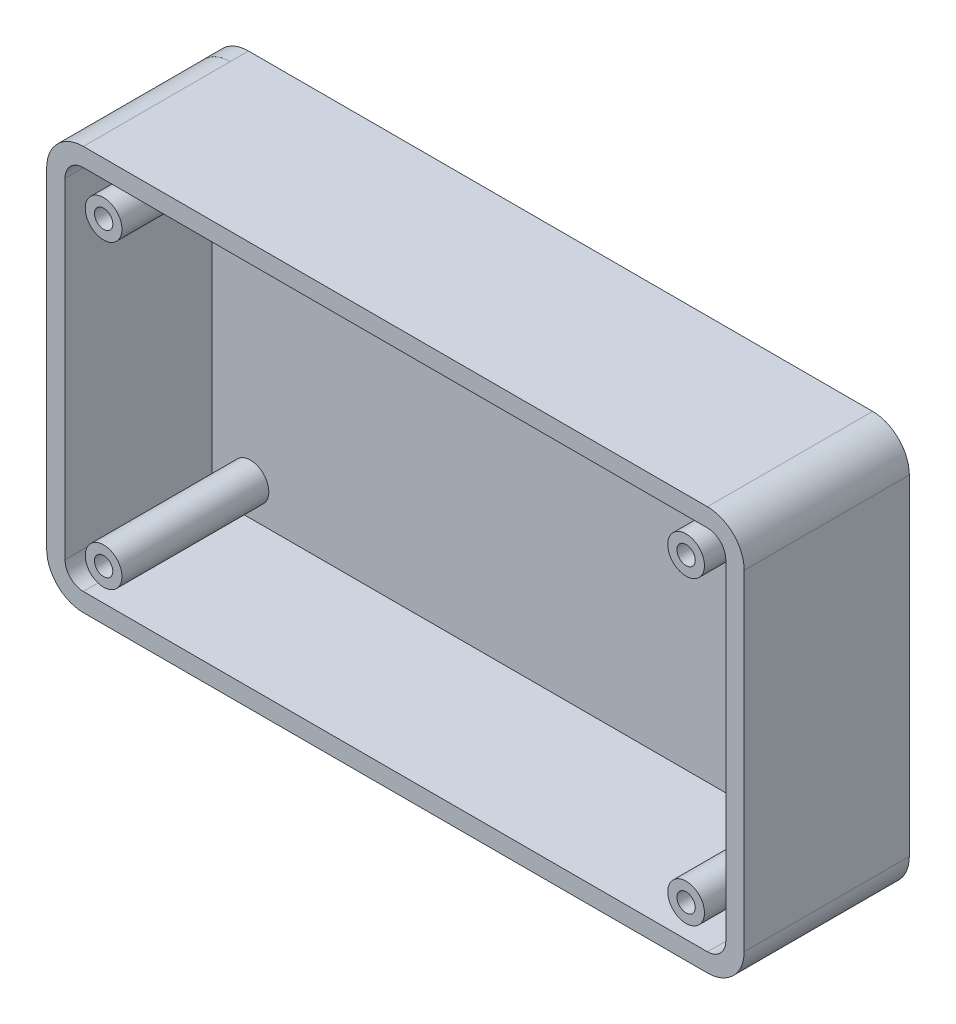
ISO-10303-21;
HEADER;
FILE_DESCRIPTION(('STEP AP214'),'2;1');
FILE_NAME('part.step','',(''),(''),'','','');
FILE_SCHEMA(('AUTOMOTIVE_DESIGN { 1 0 10303 214 1 1 1 1 }'));
ENDSEC;
DATA;
#1=APPLICATION_CONTEXT('core data for automotive mechanical design processes');
#2=APPLICATION_PROTOCOL_DEFINITION('international standard','automotive_design',2000,#1);
#3=PRODUCT_CONTEXT('',#1,'mechanical');
#4=PRODUCT('Part','Part','',(#3));
#5=PRODUCT_RELATED_PRODUCT_CATEGORY('part','',(#4));
#6=PRODUCT_DEFINITION_FORMATION('','',#4);
#7=PRODUCT_DEFINITION_CONTEXT('part definition',#1,'design');
#8=PRODUCT_DEFINITION('design','',#6,#7);
#9=PRODUCT_DEFINITION_SHAPE('','',#8);
#10=(LENGTH_UNIT() NAMED_UNIT(*) SI_UNIT(.MILLI.,.METRE.));
#11=(NAMED_UNIT(*) PLANE_ANGLE_UNIT() SI_UNIT($,.RADIAN.));
#12=(NAMED_UNIT(*) SI_UNIT($,.STERADIAN.) SOLID_ANGLE_UNIT());
#13=UNCERTAINTY_MEASURE_WITH_UNIT(LENGTH_MEASURE(1.E-05),#10,'distance_accuracy_value','');
#14=(GEOMETRIC_REPRESENTATION_CONTEXT(3) GLOBAL_UNCERTAINTY_ASSIGNED_CONTEXT((#13)) GLOBAL_UNIT_ASSIGNED_CONTEXT((#10,
#11,#12)) REPRESENTATION_CONTEXT('',''));
#15=CARTESIAN_POINT('',(0.,0.,0.));
#16=DIRECTION('',(0.,0.,1.));
#17=DIRECTION('',(1.,0.,0.));
#18=AXIS2_PLACEMENT_3D('',#15,#16,#17);
#19=CARTESIAN_POINT('',(-85.,-45.,40.));
#20=DIRECTION('',(0.,0.,1.));
#21=DIRECTION('',(1.,0.,0.));
#22=AXIS2_PLACEMENT_3D('',#19,#20,#21);
#23=PLANE('',#22);
#24=CARTESIAN_POINT('',(-85.,-45.,40.));
#25=DIRECTION('',(0.,0.,1.));
#26=DIRECTION('',(1.,0.,0.));
#27=AXIS2_PLACEMENT_3D('',#24,#25,#26);
#28=CIRCLE('',#27,10.);
#29=CARTESIAN_POINT('',(-95.,-45.,40.));
#30=VERTEX_POINT('',#29);
#31=CARTESIAN_POINT('',(-85.,-55.,40.));
#32=VERTEX_POINT('',#31);
#33=EDGE_CURVE('E163',#30,#32,#28,.T.);
#34=ORIENTED_EDGE('',*,*,#33,.T.);
#35=DIRECTION('',(1.,0.,0.));
#36=VECTOR('',#35,1.);
#37=CARTESIAN_POINT('',(-85.,-55.,40.));
#38=LINE('',#37,#36);
#39=CARTESIAN_POINT('',(84.9999999999999,-55.,40.));
#40=VERTEX_POINT('',#39);
#41=EDGE_CURVE('E241',#32,#40,#38,.T.);
#42=ORIENTED_EDGE('',*,*,#41,.T.);
#43=CARTESIAN_POINT('',(85.,-45.,40.));
#44=DIRECTION('',(0.,0.,1.));
#45=DIRECTION('',(-1.,0.,0.));
#46=AXIS2_PLACEMENT_3D('',#43,#44,#45);
#47=CIRCLE('',#46,10.);
#48=CARTESIAN_POINT('',(95.,-45.,40.));
#49=VERTEX_POINT('',#48);
#50=EDGE_CURVE('E243',#40,#49,#47,.T.);
#51=ORIENTED_EDGE('',*,*,#50,.T.);
#52=DIRECTION('',(0.,1.,0.));
#53=VECTOR('',#52,1.);
#54=CARTESIAN_POINT('',(95.,-45.,40.));
#55=LINE('',#54,#53);
#56=CARTESIAN_POINT('',(95.,44.9999999999999,40.));
#57=VERTEX_POINT('',#56);
#58=EDGE_CURVE('E245',#49,#57,#55,.T.);
#59=ORIENTED_EDGE('',*,*,#58,.T.);
#60=CARTESIAN_POINT('',(85.,45.,40.));
#61=DIRECTION('',(0.,0.,1.));
#62=DIRECTION('',(1.,0.,0.));
#63=AXIS2_PLACEMENT_3D('',#60,#61,#62);
#64=CIRCLE('',#63,9.99999999999999);
#65=CARTESIAN_POINT('',(85.,55.,40.));
#66=VERTEX_POINT('',#65);
#67=EDGE_CURVE('E132',#57,#66,#64,.T.);
#68=ORIENTED_EDGE('',*,*,#67,.T.);
#69=DIRECTION('',(-1.,0.,0.));
#70=VECTOR('',#69,1.);
#71=CARTESIAN_POINT('',(-85.,55.,40.));
#72=LINE('',#71,#70);
#73=CARTESIAN_POINT('',(-85.,55.,40.));
#74=VERTEX_POINT('',#73);
#75=EDGE_CURVE('E125',#66,#74,#72,.T.);
#76=ORIENTED_EDGE('',*,*,#75,.T.);
#77=CARTESIAN_POINT('',(-85.,45.,40.));
#78=DIRECTION('',(0.,0.,1.));
#79=DIRECTION('',(1.,0.,0.));
#80=AXIS2_PLACEMENT_3D('',#77,#78,#79);
#81=CIRCLE('',#80,10.);
#82=CARTESIAN_POINT('',(-95.,45.,40.));
#83=VERTEX_POINT('',#82);
#84=EDGE_CURVE('E129',#74,#83,#81,.T.);
#85=ORIENTED_EDGE('',*,*,#84,.T.);
#86=DIRECTION('',(0.,-1.,0.));
#87=VECTOR('',#86,1.);
#88=CARTESIAN_POINT('',(-95.,-45.,40.));
#89=LINE('',#88,#87);
#90=EDGE_CURVE('E62',#83,#30,#89,.T.);
#91=ORIENTED_EDGE('',*,*,#90,.T.);
#92=EDGE_LOOP('',(#34,#42,#51,#59,#68,#76,#85,#91));
#93=FACE_BOUND('',#92,.T.);
#94=DIRECTION('',(-1.,0.,0.));
#95=VECTOR('',#94,1.);
#96=CARTESIAN_POINT('',(-85.,50.,40.));
#97=LINE('',#96,#95);
#98=CARTESIAN_POINT('',(85.,50.,40.));
#99=VERTEX_POINT('',#98);
#100=CARTESIAN_POINT('',(-85.,50.,40.));
#101=VERTEX_POINT('',#100);
#102=EDGE_CURVE('E219',#99,#101,#97,.T.);
#103=ORIENTED_EDGE('',*,*,#102,.F.);
#104=CARTESIAN_POINT('',(85.,45.,40.));
#105=DIRECTION('',(0.,0.,1.));
#106=DIRECTION('',(1.,0.,0.));
#107=AXIS2_PLACEMENT_3D('',#104,#105,#106);
#108=CIRCLE('',#107,5.);
#109=CARTESIAN_POINT('',(90.,45.,40.));
#110=VERTEX_POINT('',#109);
#111=EDGE_CURVE('E216',#110,#99,#108,.T.);
#112=ORIENTED_EDGE('',*,*,#111,.F.);
#113=DIRECTION('',(0.,1.,0.));
#114=VECTOR('',#113,1.);
#115=CARTESIAN_POINT('',(90.,-45.,40.));
#116=LINE('',#115,#114);
#117=CARTESIAN_POINT('',(90.,-45.,40.));
#118=VERTEX_POINT('',#117);
#119=EDGE_CURVE('E84',#118,#110,#116,.T.);
#120=ORIENTED_EDGE('',*,*,#119,.F.);
#121=CARTESIAN_POINT('',(85.,-45.,40.));
#122=DIRECTION('',(0.,0.,1.));
#123=DIRECTION('',(-1.,0.,0.));
#124=AXIS2_PLACEMENT_3D('',#121,#122,#123);
#125=CIRCLE('',#124,5.);
#126=CARTESIAN_POINT('',(85.,-50.,40.));
#127=VERTEX_POINT('',#126);
#128=EDGE_CURVE('E329',#127,#118,#125,.T.);
#129=ORIENTED_EDGE('',*,*,#128,.F.);
#130=DIRECTION('',(1.,0.,0.));
#131=VECTOR('',#130,1.);
#132=CARTESIAN_POINT('',(-85.,-50.,40.));
#133=LINE('',#132,#131);
#134=CARTESIAN_POINT('',(-85.,-50.,40.));
#135=VERTEX_POINT('',#134);
#136=EDGE_CURVE('E327',#135,#127,#133,.T.);
#137=ORIENTED_EDGE('',*,*,#136,.F.);
#138=CARTESIAN_POINT('',(-85.,-45.,40.));
#139=DIRECTION('',(0.,0.,1.));
#140=DIRECTION('',(1.,0.,0.));
#141=AXIS2_PLACEMENT_3D('',#138,#139,#140);
#142=CIRCLE('',#141,5.);
#143=CARTESIAN_POINT('',(-90.,-45.,40.));
#144=VERTEX_POINT('',#143);
#145=EDGE_CURVE('E324',#144,#135,#142,.T.);
#146=ORIENTED_EDGE('',*,*,#145,.F.);
#147=DIRECTION('',(0.,-1.,0.));
#148=VECTOR('',#147,1.);
#149=CARTESIAN_POINT('',(-90.,-45.,40.));
#150=LINE('',#149,#148);
#151=CARTESIAN_POINT('',(-90.,45.,40.));
#152=VERTEX_POINT('',#151);
#153=EDGE_CURVE('E321',#152,#144,#150,.T.);
#154=ORIENTED_EDGE('',*,*,#153,.F.);
#155=CARTESIAN_POINT('',(-85.,45.,40.));
#156=DIRECTION('',(0.,0.,1.));
#157=DIRECTION('',(1.,0.,0.));
#158=AXIS2_PLACEMENT_3D('',#155,#156,#157);
#159=CIRCLE('',#158,5.);
#160=EDGE_CURVE('E318',#101,#152,#159,.T.);
#161=ORIENTED_EDGE('',*,*,#160,.F.);
#162=EDGE_LOOP('',(#103,#112,#120,#129,#137,#146,#154,#161));
#163=FACE_BOUND('',#162,.T.);
#164=ADVANCED_FACE('F37',(#93,#163),#23,.T.);
#165=CARTESIAN_POINT('',(-85.,-45.,40.));
#166=DIRECTION('',(0.,0.,-1.));
#167=DIRECTION('',(-1.,0.,0.));
#168=AXIS2_PLACEMENT_3D('',#165,#166,#167);
#169=CYLINDRICAL_SURFACE('',#168,10.);
#170=CARTESIAN_POINT('',(-85.,-45.,0.));
#171=DIRECTION('',(0.,0.,1.));
#172=DIRECTION('',(1.,0.,0.));
#173=AXIS2_PLACEMENT_3D('',#170,#171,#172);
#174=CIRCLE('',#173,10.);
#175=CARTESIAN_POINT('',(-95.,-45.,0.));
#176=VERTEX_POINT('',#175);
#177=CARTESIAN_POINT('',(-85.,-55.,0.));
#178=VERTEX_POINT('',#177);
#179=EDGE_CURVE('E156',#176,#178,#174,.T.);
#180=ORIENTED_EDGE('',*,*,#179,.T.);
#181=DIRECTION('',(0.,0.,-1.));
#182=VECTOR('',#181,1.);
#183=CARTESIAN_POINT('',(-85.,-55.,40.));
#184=LINE('',#183,#182);
#185=EDGE_CURVE('E177',#32,#178,#184,.T.);
#186=ORIENTED_EDGE('',*,*,#185,.F.);
#187=ORIENTED_EDGE('',*,*,#33,.F.);
#188=DIRECTION('',(0.,0.,-1.));
#189=VECTOR('',#188,1.);
#190=CARTESIAN_POINT('',(-95.,-45.,40.));
#191=LINE('',#190,#189);
#192=EDGE_CURVE('E152',#30,#176,#191,.T.);
#193=ORIENTED_EDGE('',*,*,#192,.T.);
#194=EDGE_LOOP('',(#180,#186,#187,#193));
#195=FACE_BOUND('',#194,.T.);
#196=ADVANCED_FACE('F39',(#195),#169,.T.);
#197=CARTESIAN_POINT('',(-85.,-55.,40.));
#198=DIRECTION('',(0.,1.,0.));
#199=DIRECTION('',(-1.,0.,0.));
#200=AXIS2_PLACEMENT_3D('',#197,#198,#199);
#201=PLANE('',#200);
#202=ORIENTED_EDGE('',*,*,#185,.T.);
#203=DIRECTION('',(-1.,0.,0.));
#204=VECTOR('',#203,1.);
#205=CARTESIAN_POINT('',(84.9999999999999,-55.,0.));
#206=LINE('',#205,#204);
#207=CARTESIAN_POINT('',(-85.0258057865892,-55.,0.));
#208=VERTEX_POINT('',#207);
#209=EDGE_CURVE('E298',#178,#208,#206,.T.);
#210=ORIENTED_EDGE('',*,*,#209,.T.);
#211=DIRECTION('',(0.,0.,1.));
#212=VECTOR('',#211,1.);
#213=CARTESIAN_POINT('',(-85.0258057865892,-55.,-5.));
#214=LINE('',#213,#212);
#215=CARTESIAN_POINT('',(-85.0258057865892,-55.,-5.));
#216=VERTEX_POINT('',#215);
#217=EDGE_CURVE('E311',#216,#208,#214,.T.);
#218=ORIENTED_EDGE('',*,*,#217,.F.);
#219=DIRECTION('',(-1.,0.,0.));
#220=VECTOR('',#219,1.);
#221=CARTESIAN_POINT('',(84.9999999999999,-55.,-5.));
#222=LINE('',#221,#220);
#223=CARTESIAN_POINT('',(84.9999999999999,-55.,-5.));
#224=VERTEX_POINT('',#223);
#225=EDGE_CURVE('E284',#224,#216,#222,.T.);
#226=ORIENTED_EDGE('',*,*,#225,.F.);
#227=DIRECTION('',(0.,0.,-1.));
#228=VECTOR('',#227,1.);
#229=CARTESIAN_POINT('',(84.9999999999999,-55.,40.));
#230=LINE('',#229,#228);
#231=EDGE_CURVE('E174',#40,#224,#230,.T.);
#232=ORIENTED_EDGE('',*,*,#231,.F.);
#233=ORIENTED_EDGE('',*,*,#41,.F.);
#234=EDGE_LOOP('',(#202,#210,#218,#226,#232,#233));
#235=FACE_BOUND('',#234,.T.);
#236=ADVANCED_FACE('F412',(#235),#201,.F.);
#237=CARTESIAN_POINT('',(85.,-45.,40.));
#238=DIRECTION('',(0.,0.,-1.));
#239=DIRECTION('',(-1.,0.,0.));
#240=AXIS2_PLACEMENT_3D('',#237,#238,#239);
#241=CYLINDRICAL_SURFACE('',#240,10.);
#242=ORIENTED_EDGE('',*,*,#231,.T.);
#243=CARTESIAN_POINT('',(85.,-45.,-5.));
#244=DIRECTION('',(0.,0.,-1.));
#245=DIRECTION('',(1.,0.,0.));
#246=AXIS2_PLACEMENT_3D('',#243,#244,#245);
#247=CIRCLE('',#246,9.99999999999999);
#248=CARTESIAN_POINT('',(95.,-45.,-5.));
#249=VERTEX_POINT('',#248);
#250=EDGE_CURVE('E281',#249,#224,#247,.T.);
#251=ORIENTED_EDGE('',*,*,#250,.F.);
#252=DIRECTION('',(0.,0.,-1.));
#253=VECTOR('',#252,1.);
#254=CARTESIAN_POINT('',(95.,-45.,40.));
#255=LINE('',#254,#253);
#256=EDGE_CURVE('E171',#49,#249,#255,.T.);
#257=ORIENTED_EDGE('',*,*,#256,.F.);
#258=ORIENTED_EDGE('',*,*,#50,.F.);
#259=EDGE_LOOP('',(#242,#251,#257,#258));
#260=FACE_BOUND('',#259,.T.);
#261=ADVANCED_FACE('F409',(#260),#241,.T.);
#262=CARTESIAN_POINT('',(95.,-45.,40.));
#263=DIRECTION('',(-1.,0.,0.));
#264=DIRECTION('',(0.,-1.,0.));
#265=AXIS2_PLACEMENT_3D('',#262,#263,#264);
#266=PLANE('',#265);
#267=ORIENTED_EDGE('',*,*,#256,.T.);
#268=DIRECTION('',(0.,-1.,0.));
#269=VECTOR('',#268,1.);
#270=CARTESIAN_POINT('',(95.,-44.9999999999999,-5.));
#271=LINE('',#270,#269);
#272=CARTESIAN_POINT('',(95.,44.9999999999999,-5.));
#273=VERTEX_POINT('',#272);
#274=EDGE_CURVE('E255',#273,#249,#271,.T.);
#275=ORIENTED_EDGE('',*,*,#274,.F.);
#276=DIRECTION('',(0.,0.,-1.));
#277=VECTOR('',#276,1.);
#278=CARTESIAN_POINT('',(95.,44.9999999999999,40.));
#279=LINE('',#278,#277);
#280=EDGE_CURVE('E168',#57,#273,#279,.T.);
#281=ORIENTED_EDGE('',*,*,#280,.F.);
#282=ORIENTED_EDGE('',*,*,#58,.F.);
#283=EDGE_LOOP('',(#267,#275,#281,#282));
#284=FACE_BOUND('',#283,.T.);
#285=ADVANCED_FACE('F252',(#284),#266,.F.);
#286=CARTESIAN_POINT('',(85.,45.,40.));
#287=DIRECTION('',(0.,0.,-1.));
#288=DIRECTION('',(-1.,0.,0.));
#289=AXIS2_PLACEMENT_3D('',#286,#287,#288);
#290=CYLINDRICAL_SURFACE('',#289,9.99999999999999);
#291=ORIENTED_EDGE('',*,*,#280,.T.);
#292=CARTESIAN_POINT('',(85.,45.,-5.));
#293=DIRECTION('',(0.,0.,-1.));
#294=DIRECTION('',(1.,0.,0.));
#295=AXIS2_PLACEMENT_3D('',#292,#293,#294);
#296=CIRCLE('',#295,9.99999999999999);
#297=CARTESIAN_POINT('',(84.9999999999999,55.,-5.));
#298=VERTEX_POINT('',#297);
#299=EDGE_CURVE('E261',#298,#273,#296,.T.);
#300=ORIENTED_EDGE('',*,*,#299,.F.);
#301=DIRECTION('',(0.,0.,-1.));
#302=VECTOR('',#301,1.);
#303=CARTESIAN_POINT('',(85.,55.,40.));
#304=LINE('',#303,#302);
#305=EDGE_CURVE('E146',#66,#298,#304,.T.);
#306=ORIENTED_EDGE('',*,*,#305,.F.);
#307=ORIENTED_EDGE('',*,*,#67,.F.);
#308=EDGE_LOOP('',(#291,#300,#306,#307));
#309=FACE_BOUND('',#308,.T.);
#310=ADVANCED_FACE('F259',(#309),#290,.T.);
#311=CARTESIAN_POINT('',(-85.,55.,40.));
#312=DIRECTION('',(0.,-1.,0.));
#313=DIRECTION('',(1.,0.,0.));
#314=AXIS2_PLACEMENT_3D('',#311,#312,#313);
#315=PLANE('',#314);
#316=ORIENTED_EDGE('',*,*,#305,.T.);
#317=DIRECTION('',(1.,0.,0.));
#318=VECTOR('',#317,1.);
#319=CARTESIAN_POINT('',(84.9999999999999,55.,-5.));
#320=LINE('',#319,#318);
#321=CARTESIAN_POINT('',(-85.0258057865892,55.,-5.));
#322=VERTEX_POINT('',#321);
#323=EDGE_CURVE('E265',#322,#298,#320,.T.);
#324=ORIENTED_EDGE('',*,*,#323,.F.);
#325=DIRECTION('',(0.,0.,1.));
#326=VECTOR('',#325,1.);
#327=CARTESIAN_POINT('',(-85.0258057865892,55.,-5.));
#328=LINE('',#327,#326);
#329=CARTESIAN_POINT('',(-85.0258057865892,55.,0.));
#330=VERTEX_POINT('',#329);
#331=EDGE_CURVE('E314',#322,#330,#328,.T.);
#332=ORIENTED_EDGE('',*,*,#331,.T.);
#333=DIRECTION('',(1.,0.,0.));
#334=VECTOR('',#333,1.);
#335=CARTESIAN_POINT('',(84.9999999999999,55.,0.));
#336=LINE('',#335,#334);
#337=CARTESIAN_POINT('',(-85.,55.,0.));
#338=VERTEX_POINT('',#337);
#339=EDGE_CURVE('E144',#330,#338,#336,.T.);
#340=ORIENTED_EDGE('',*,*,#339,.T.);
#341=DIRECTION('',(0.,0.,-1.));
#342=VECTOR('',#341,1.);
#343=CARTESIAN_POINT('',(-85.,55.,40.));
#344=LINE('',#343,#342);
#345=EDGE_CURVE('E139',#74,#338,#344,.T.);
#346=ORIENTED_EDGE('',*,*,#345,.F.);
#347=ORIENTED_EDGE('',*,*,#75,.F.);
#348=EDGE_LOOP('',(#316,#324,#332,#340,#346,#347));
#349=FACE_BOUND('',#348,.T.);
#350=ADVANCED_FACE('F140',(#349),#315,.F.);
#351=CARTESIAN_POINT('',(-85.,45.,40.));
#352=DIRECTION('',(0.,0.,-1.));
#353=DIRECTION('',(-1.,0.,0.));
#354=AXIS2_PLACEMENT_3D('',#351,#352,#353);
#355=CYLINDRICAL_SURFACE('',#354,10.);
#356=CARTESIAN_POINT('',(-85.,45.,0.));
#357=DIRECTION('',(0.,0.,1.));
#358=DIRECTION('',(1.,0.,0.));
#359=AXIS2_PLACEMENT_3D('',#356,#357,#358);
#360=CIRCLE('',#359,10.);
#361=CARTESIAN_POINT('',(-95.,45.,0.));
#362=VERTEX_POINT('',#361);
#363=EDGE_CURVE('E159',#338,#362,#360,.T.);
#364=ORIENTED_EDGE('',*,*,#363,.T.);
#365=DIRECTION('',(0.,0.,-1.));
#366=VECTOR('',#365,1.);
#367=CARTESIAN_POINT('',(-95.,45.,40.));
#368=LINE('',#367,#366);
#369=EDGE_CURVE('E147',#83,#362,#368,.T.);
#370=ORIENTED_EDGE('',*,*,#369,.F.);
#371=ORIENTED_EDGE('',*,*,#84,.F.);
#372=ORIENTED_EDGE('',*,*,#345,.T.);
#373=EDGE_LOOP('',(#364,#370,#371,#372));
#374=FACE_BOUND('',#373,.T.);
#375=ADVANCED_FACE('F149',(#374),#355,.T.);
#376=CARTESIAN_POINT('',(-95.,-45.,40.));
#377=DIRECTION('',(1.,0.,0.));
#378=DIRECTION('',(0.,0.,-1.));
#379=AXIS2_PLACEMENT_3D('',#376,#377,#378);
#380=PLANE('',#379);
#381=DIRECTION('',(0.,-1.,0.));
#382=VECTOR('',#381,1.);
#383=CARTESIAN_POINT('',(-95.,-45.,0.));
#384=LINE('',#383,#382);
#385=EDGE_CURVE('E75',#362,#176,#384,.T.);
#386=ORIENTED_EDGE('',*,*,#385,.T.);
#387=ORIENTED_EDGE('',*,*,#192,.F.);
#388=ORIENTED_EDGE('',*,*,#90,.F.);
#389=ORIENTED_EDGE('',*,*,#369,.T.);
#390=EDGE_LOOP('',(#386,#387,#388,#389));
#391=FACE_BOUND('',#390,.T.);
#392=ADVANCED_FACE('F427',(#391),#380,.F.);
#393=CARTESIAN_POINT('',(85.,45.,40.));
#394=DIRECTION('',(0.,0.,-1.));
#395=DIRECTION('',(-1.,0.,0.));
#396=AXIS2_PLACEMENT_3D('',#393,#394,#395);
#397=CYLINDRICAL_SURFACE('',#396,5.);
#398=CARTESIAN_POINT('',(85.,45.,0.));
#399=DIRECTION('',(0.,0.,1.));
#400=DIRECTION('',(1.,0.,0.));
#401=AXIS2_PLACEMENT_3D('',#398,#399,#400);
#402=CIRCLE('',#401,5.);
#403=CARTESIAN_POINT('',(90.,45.,0.));
#404=VERTEX_POINT('',#403);
#405=CARTESIAN_POINT('',(85.,50.,0.));
#406=VERTEX_POINT('',#405);
#407=EDGE_CURVE('E211',#404,#406,#402,.T.);
#408=ORIENTED_EDGE('',*,*,#407,.F.);
#409=DIRECTION('',(0.,0.,-1.));
#410=VECTOR('',#409,1.);
#411=CARTESIAN_POINT('',(90.,45.,40.));
#412=LINE('',#411,#410);
#413=EDGE_CURVE('E225',#110,#404,#412,.T.);
#414=ORIENTED_EDGE('',*,*,#413,.F.);
#415=ORIENTED_EDGE('',*,*,#111,.T.);
#416=DIRECTION('',(0.,0.,-1.));
#417=VECTOR('',#416,1.);
#418=CARTESIAN_POINT('',(85.,50.,40.));
#419=LINE('',#418,#417);
#420=EDGE_CURVE('E160',#99,#406,#419,.T.);
#421=ORIENTED_EDGE('',*,*,#420,.T.);
#422=EDGE_LOOP('',(#408,#414,#415,#421));
#423=FACE_BOUND('',#422,.T.);
#424=ADVANCED_FACE('F358',(#423),#397,.F.);
#425=CARTESIAN_POINT('',(-85.,50.,40.));
#426=DIRECTION('',(0.,-1.,0.));
#427=DIRECTION('',(0.,0.,-1.));
#428=AXIS2_PLACEMENT_3D('',#425,#426,#427);
#429=PLANE('',#428);
#430=DIRECTION('',(-1.,0.,0.));
#431=VECTOR('',#430,1.);
#432=CARTESIAN_POINT('',(-85.,50.,0.));
#433=LINE('',#432,#431);
#434=CARTESIAN_POINT('',(-85.,50.,0.));
#435=VERTEX_POINT('',#434);
#436=EDGE_CURVE('E333',#406,#435,#433,.T.);
#437=ORIENTED_EDGE('',*,*,#436,.F.);
#438=ORIENTED_EDGE('',*,*,#420,.F.);
#439=ORIENTED_EDGE('',*,*,#102,.T.);
#440=DIRECTION('',(0.,0.,-1.));
#441=VECTOR('',#440,1.);
#442=CARTESIAN_POINT('',(-85.,50.,40.));
#443=LINE('',#442,#441);
#444=EDGE_CURVE('E236',#101,#435,#443,.T.);
#445=ORIENTED_EDGE('',*,*,#444,.T.);
#446=EDGE_LOOP('',(#437,#438,#439,#445));
#447=FACE_BOUND('',#446,.T.);
#448=ADVANCED_FACE('F362',(#447),#429,.T.);
#449=CARTESIAN_POINT('',(-85.,45.,40.));
#450=DIRECTION('',(0.,0.,-1.));
#451=DIRECTION('',(-1.,0.,0.));
#452=AXIS2_PLACEMENT_3D('',#449,#450,#451);
#453=CYLINDRICAL_SURFACE('',#452,5.);
#454=CARTESIAN_POINT('',(-85.,45.,0.));
#455=DIRECTION('',(0.,0.,1.));
#456=DIRECTION('',(1.,0.,0.));
#457=AXIS2_PLACEMENT_3D('',#454,#455,#456);
#458=CIRCLE('',#457,5.);
#459=CARTESIAN_POINT('',(-90.,45.,0.));
#460=VERTEX_POINT('',#459);
#461=EDGE_CURVE('E335',#435,#460,#458,.T.);
#462=ORIENTED_EDGE('',*,*,#461,.F.);
#463=ORIENTED_EDGE('',*,*,#444,.F.);
#464=ORIENTED_EDGE('',*,*,#160,.T.);
#465=DIRECTION('',(0.,0.,-1.));
#466=VECTOR('',#465,1.);
#467=CARTESIAN_POINT('',(-90.,45.,40.));
#468=LINE('',#467,#466);
#469=EDGE_CURVE('E234',#152,#460,#468,.T.);
#470=ORIENTED_EDGE('',*,*,#469,.T.);
#471=EDGE_LOOP('',(#462,#463,#464,#470));
#472=FACE_BOUND('',#471,.T.);
#473=ADVANCED_FACE('F367',(#472),#453,.F.);
#474=CARTESIAN_POINT('',(-90.,-45.,40.));
#475=DIRECTION('',(1.,0.,0.));
#476=DIRECTION('',(0.,0.,-1.));
#477=AXIS2_PLACEMENT_3D('',#474,#475,#476);
#478=PLANE('',#477);
#479=DIRECTION('',(0.,-1.,0.));
#480=VECTOR('',#479,1.);
#481=CARTESIAN_POINT('',(-90.,-45.,0.));
#482=LINE('',#481,#480);
#483=CARTESIAN_POINT('',(-90.,-45.,0.));
#484=VERTEX_POINT('',#483);
#485=EDGE_CURVE('E338',#460,#484,#482,.T.);
#486=ORIENTED_EDGE('',*,*,#485,.F.);
#487=ORIENTED_EDGE('',*,*,#469,.F.);
#488=ORIENTED_EDGE('',*,*,#153,.T.);
#489=DIRECTION('',(0.,0.,-1.));
#490=VECTOR('',#489,1.);
#491=CARTESIAN_POINT('',(-90.,-45.,40.));
#492=LINE('',#491,#490);
#493=EDGE_CURVE('E232',#144,#484,#492,.T.);
#494=ORIENTED_EDGE('',*,*,#493,.T.);
#495=EDGE_LOOP('',(#486,#487,#488,#494));
#496=FACE_BOUND('',#495,.T.);
#497=ADVANCED_FACE('F372',(#496),#478,.T.);
#498=CARTESIAN_POINT('',(-85.,-45.,40.));
#499=DIRECTION('',(0.,0.,-1.));
#500=DIRECTION('',(-1.,0.,0.));
#501=AXIS2_PLACEMENT_3D('',#498,#499,#500);
#502=CYLINDRICAL_SURFACE('',#501,5.);
#503=CARTESIAN_POINT('',(-85.,-45.,0.));
#504=DIRECTION('',(0.,0.,1.));
#505=DIRECTION('',(1.,0.,0.));
#506=AXIS2_PLACEMENT_3D('',#503,#504,#505);
#507=CIRCLE('',#506,5.);
#508=CARTESIAN_POINT('',(-85.,-50.,0.));
#509=VERTEX_POINT('',#508);
#510=EDGE_CURVE('E341',#484,#509,#507,.T.);
#511=ORIENTED_EDGE('',*,*,#510,.F.);
#512=ORIENTED_EDGE('',*,*,#493,.F.);
#513=ORIENTED_EDGE('',*,*,#145,.T.);
#514=DIRECTION('',(0.,0.,-1.));
#515=VECTOR('',#514,1.);
#516=CARTESIAN_POINT('',(-85.,-50.,40.));
#517=LINE('',#516,#515);
#518=EDGE_CURVE('E230',#135,#509,#517,.T.);
#519=ORIENTED_EDGE('',*,*,#518,.T.);
#520=EDGE_LOOP('',(#511,#512,#513,#519));
#521=FACE_BOUND('',#520,.T.);
#522=ADVANCED_FACE('F377',(#521),#502,.F.);
#523=CARTESIAN_POINT('',(-85.,-50.,40.));
#524=DIRECTION('',(0.,1.,0.));
#525=DIRECTION('',(0.,0.,1.));
#526=AXIS2_PLACEMENT_3D('',#523,#524,#525);
#527=PLANE('',#526);
#528=DIRECTION('',(1.,0.,0.));
#529=VECTOR('',#528,1.);
#530=CARTESIAN_POINT('',(-85.,-50.,0.));
#531=LINE('',#530,#529);
#532=CARTESIAN_POINT('',(85.,-50.,0.));
#533=VERTEX_POINT('',#532);
#534=EDGE_CURVE('E221',#509,#533,#531,.T.);
#535=ORIENTED_EDGE('',*,*,#534,.F.);
#536=ORIENTED_EDGE('',*,*,#518,.F.);
#537=ORIENTED_EDGE('',*,*,#136,.T.);
#538=DIRECTION('',(0.,0.,-1.));
#539=VECTOR('',#538,1.);
#540=CARTESIAN_POINT('',(85.,-50.,40.));
#541=LINE('',#540,#539);
#542=EDGE_CURVE('E228',#127,#533,#541,.T.);
#543=ORIENTED_EDGE('',*,*,#542,.T.);
#544=EDGE_LOOP('',(#535,#536,#537,#543));
#545=FACE_BOUND('',#544,.T.);
#546=ADVANCED_FACE('F347',(#545),#527,.T.);
#547=CARTESIAN_POINT('',(85.,-45.,40.));
#548=DIRECTION('',(0.,0.,-1.));
#549=DIRECTION('',(-1.,0.,0.));
#550=AXIS2_PLACEMENT_3D('',#547,#548,#549);
#551=CYLINDRICAL_SURFACE('',#550,5.);
#552=CARTESIAN_POINT('',(85.,-45.,0.));
#553=DIRECTION('',(0.,0.,1.));
#554=DIRECTION('',(-1.,0.,0.));
#555=AXIS2_PLACEMENT_3D('',#552,#553,#554);
#556=CIRCLE('',#555,5.);
#557=CARTESIAN_POINT('',(90.,-45.,0.));
#558=VERTEX_POINT('',#557);
#559=EDGE_CURVE('E214',#533,#558,#556,.T.);
#560=ORIENTED_EDGE('',*,*,#559,.F.);
#561=ORIENTED_EDGE('',*,*,#542,.F.);
#562=ORIENTED_EDGE('',*,*,#128,.T.);
#563=DIRECTION('',(0.,0.,-1.));
#564=VECTOR('',#563,1.);
#565=CARTESIAN_POINT('',(90.,-45.,40.));
#566=LINE('',#565,#564);
#567=EDGE_CURVE('E53',#118,#558,#566,.T.);
#568=ORIENTED_EDGE('',*,*,#567,.T.);
#569=EDGE_LOOP('',(#560,#561,#562,#568));
#570=FACE_BOUND('',#569,.T.);
#571=ADVANCED_FACE('F352',(#570),#551,.F.);
#572=CARTESIAN_POINT('',(90.,-45.,40.));
#573=DIRECTION('',(-1.,0.,0.));
#574=DIRECTION('',(0.,0.,1.));
#575=AXIS2_PLACEMENT_3D('',#572,#573,#574);
#576=PLANE('',#575);
#577=DIRECTION('',(0.,1.,0.));
#578=VECTOR('',#577,1.);
#579=CARTESIAN_POINT('',(90.,-45.,0.));
#580=LINE('',#579,#578);
#581=EDGE_CURVE('E208',#558,#404,#580,.T.);
#582=ORIENTED_EDGE('',*,*,#581,.F.);
#583=ORIENTED_EDGE('',*,*,#567,.F.);
#584=ORIENTED_EDGE('',*,*,#119,.T.);
#585=ORIENTED_EDGE('',*,*,#413,.T.);
#586=EDGE_LOOP('',(#582,#583,#584,#585));
#587=FACE_BOUND('',#586,.T.);
#588=ADVANCED_FACE('F195',(#587),#576,.T.);
#589=CARTESIAN_POINT('',(-85.0258057865892,45.,0.));
#590=DIRECTION('',(0.,0.,-1.));
#591=DIRECTION('',(-1.,0.,0.));
#592=AXIS2_PLACEMENT_3D('',#589,#590,#591);
#593=PLANE('',#592);
#594=CARTESIAN_POINT('',(79.186023927392,-41.2380618962886,0.));
#595=DIRECTION('',(0.,0.,-1.));
#596=DIRECTION('',(-1.,0.,0.));
#597=AXIS2_PLACEMENT_3D('',#594,#595,#596);
#598=CIRCLE('',#597,5.00000000000001);
#599=CARTESIAN_POINT('',(74.186023927392,-41.2380618962886,0.));
#600=VERTEX_POINT('',#599);
#601=EDGE_CURVE('E11',#600,#600,#598,.F.);
#602=ORIENTED_EDGE('',*,*,#601,.F.);
#603=EDGE_LOOP('',(#602));
#604=FACE_BOUND('',#603,.T.);
#605=CARTESIAN_POINT('',(-79.4849294616388,-41.2380618962886,0.));
#606=DIRECTION('',(0.,0.,-1.));
#607=DIRECTION('',(-1.,0.,0.));
#608=AXIS2_PLACEMENT_3D('',#605,#606,#607);
#609=CIRCLE('',#608,5.00000000000001);
#610=CARTESIAN_POINT('',(-84.4849294616388,-41.2380618962886,0.));
#611=VERTEX_POINT('',#610);
#612=EDGE_CURVE('E46',#611,#611,#609,.F.);
#613=ORIENTED_EDGE('',*,*,#612,.F.);
#614=EDGE_LOOP('',(#613));
#615=FACE_BOUND('',#614,.T.);
#616=CARTESIAN_POINT('',(79.186023927392,40.6918624009734,0.));
#617=DIRECTION('',(0.,0.,-1.));
#618=DIRECTION('',(-1.,0.,0.));
#619=AXIS2_PLACEMENT_3D('',#616,#617,#618);
#620=CIRCLE('',#619,5.00000000000001);
#621=CARTESIAN_POINT('',(74.186023927392,40.6918624009734,0.));
#622=VERTEX_POINT('',#621);
#623=EDGE_CURVE('E183',#622,#622,#620,.F.);
#624=ORIENTED_EDGE('',*,*,#623,.F.);
#625=EDGE_LOOP('',(#624));
#626=FACE_BOUND('',#625,.T.);
#627=CARTESIAN_POINT('',(-79.4849294616388,40.6918624009734,0.));
#628=DIRECTION('',(0.,0.,-1.));
#629=DIRECTION('',(-1.,0.,0.));
#630=AXIS2_PLACEMENT_3D('',#627,#628,#629);
#631=CIRCLE('',#630,5.00000000000001);
#632=CARTESIAN_POINT('',(-84.4849294616388,40.6918624009734,0.));
#633=VERTEX_POINT('',#632);
#634=EDGE_CURVE('E180',#633,#633,#631,.F.);
#635=ORIENTED_EDGE('',*,*,#634,.F.);
#636=EDGE_LOOP('',(#635));
#637=FACE_BOUND('',#636,.T.);
#638=ORIENTED_EDGE('',*,*,#581,.T.);
#639=ORIENTED_EDGE('',*,*,#407,.T.);
#640=ORIENTED_EDGE('',*,*,#436,.T.);
#641=ORIENTED_EDGE('',*,*,#461,.T.);
#642=ORIENTED_EDGE('',*,*,#485,.T.);
#643=ORIENTED_EDGE('',*,*,#510,.T.);
#644=ORIENTED_EDGE('',*,*,#534,.T.);
#645=ORIENTED_EDGE('',*,*,#559,.T.);
#646=EDGE_LOOP('',(#638,#639,#640,#641,#642,#643,#644,#645));
#647=FACE_BOUND('',#646,.T.);
#648=ADVANCED_FACE('F191',(#604,#615,#626,#637,#647),#593,.F.);
#649=CARTESIAN_POINT('',(-85.0258057865892,45.,-5.));
#650=DIRECTION('',(0.,0.,1.));
#651=DIRECTION('',(1.,0.,0.));
#652=AXIS2_PLACEMENT_3D('',#649,#650,#651);
#653=CYLINDRICAL_SURFACE('',#652,10.);
#654=CARTESIAN_POINT('',(-85.0258057865892,45.,0.));
#655=DIRECTION('',(0.,0.,-1.));
#656=DIRECTION('',(-1.,0.,0.));
#657=AXIS2_PLACEMENT_3D('',#654,#655,#656);
#658=CIRCLE('',#657,10.);
#659=CARTESIAN_POINT('',(-95.0258057865892,44.9999999999999,0.));
#660=VERTEX_POINT('',#659);
#661=EDGE_CURVE('E293',#660,#330,#658,.T.);
#662=ORIENTED_EDGE('',*,*,#661,.T.);
#663=ORIENTED_EDGE('',*,*,#331,.F.);
#664=CARTESIAN_POINT('',(-85.0258057865892,45.,-5.));
#665=DIRECTION('',(0.,0.,-1.));
#666=DIRECTION('',(-1.,0.,0.));
#667=AXIS2_PLACEMENT_3D('',#664,#665,#666);
#668=CIRCLE('',#667,10.);
#669=CARTESIAN_POINT('',(-95.0258057865892,44.9999999999999,-5.));
#670=VERTEX_POINT('',#669);
#671=EDGE_CURVE('E272',#670,#322,#668,.T.);
#672=ORIENTED_EDGE('',*,*,#671,.F.);
#673=DIRECTION('',(0.,0.,1.));
#674=VECTOR('',#673,1.);
#675=CARTESIAN_POINT('',(-95.0258057865892,44.9999999999999,-5.));
#676=LINE('',#675,#674);
#677=EDGE_CURVE('E292',#670,#660,#676,.T.);
#678=ORIENTED_EDGE('',*,*,#677,.T.);
#679=EDGE_LOOP('',(#662,#663,#672,#678));
#680=FACE_BOUND('',#679,.T.);
#681=ADVANCED_FACE('F194',(#680),#653,.T.);
#682=CARTESIAN_POINT('',(-85.0258057865893,-45.,-5.));
#683=DIRECTION('',(0.,0.,1.));
#684=DIRECTION('',(1.,0.,0.));
#685=AXIS2_PLACEMENT_3D('',#682,#683,#684);
#686=CYLINDRICAL_SURFACE('',#685,9.99999999999999);
#687=CARTESIAN_POINT('',(-85.0258057865893,-45.,0.));
#688=DIRECTION('',(0.,0.,-1.));
#689=DIRECTION('',(1.,0.,0.));
#690=AXIS2_PLACEMENT_3D('',#687,#688,#689);
#691=CIRCLE('',#690,9.99999999999999);
#692=CARTESIAN_POINT('',(-95.0258057865893,-44.9999999999999,0.));
#693=VERTEX_POINT('',#692);
#694=EDGE_CURVE('E301',#208,#693,#691,.T.);
#695=ORIENTED_EDGE('',*,*,#694,.T.);
#696=DIRECTION('',(0.,0.,1.));
#697=VECTOR('',#696,1.);
#698=CARTESIAN_POINT('',(-95.0258057865893,-44.9999999999999,-5.));
#699=LINE('',#698,#697);
#700=CARTESIAN_POINT('',(-95.0258057865893,-44.9999999999999,-5.));
#701=VERTEX_POINT('',#700);
#702=EDGE_CURVE('E308',#701,#693,#699,.T.);
#703=ORIENTED_EDGE('',*,*,#702,.F.);
#704=CARTESIAN_POINT('',(-85.0258057865893,-45.,-5.));
#705=DIRECTION('',(0.,0.,-1.));
#706=DIRECTION('',(1.,0.,0.));
#707=AXIS2_PLACEMENT_3D('',#704,#705,#706);
#708=CIRCLE('',#707,9.99999999999999);
#709=EDGE_CURVE('E287',#216,#701,#708,.T.);
#710=ORIENTED_EDGE('',*,*,#709,.F.);
#711=ORIENTED_EDGE('',*,*,#217,.T.);
#712=EDGE_LOOP('',(#695,#703,#710,#711));
#713=FACE_BOUND('',#712,.T.);
#714=ADVANCED_FACE('F419',(#713),#686,.T.);
#715=CARTESIAN_POINT('',(-95.0258057865893,-44.9999999999999,-5.));
#716=DIRECTION('',(1.,0.,0.));
#717=DIRECTION('',(0.,1.,0.));
#718=AXIS2_PLACEMENT_3D('',#715,#716,#717);
#719=PLANE('',#718);
#720=DIRECTION('',(0.,1.,0.));
#721=VECTOR('',#720,1.);
#722=CARTESIAN_POINT('',(-95.0258057865893,-44.9999999999999,0.));
#723=LINE('',#722,#721);
#724=EDGE_CURVE('E276',#693,#660,#723,.T.);
#725=ORIENTED_EDGE('',*,*,#724,.T.);
#726=ORIENTED_EDGE('',*,*,#677,.F.);
#727=DIRECTION('',(0.,1.,0.));
#728=VECTOR('',#727,1.);
#729=CARTESIAN_POINT('',(-95.0258057865893,-44.9999999999999,-5.));
#730=LINE('',#729,#728);
#731=EDGE_CURVE('E290',#701,#670,#730,.T.);
#732=ORIENTED_EDGE('',*,*,#731,.F.);
#733=ORIENTED_EDGE('',*,*,#702,.T.);
#734=EDGE_LOOP('',(#725,#726,#732,#733));
#735=FACE_BOUND('',#734,.T.);
#736=ADVANCED_FACE('F423',(#735),#719,.F.);
#737=CARTESIAN_POINT('',(-85.0258057865892,45.,-5.));
#738=DIRECTION('',(0.,0.,-1.));
#739=DIRECTION('',(-1.,0.,0.));
#740=AXIS2_PLACEMENT_3D('',#737,#738,#739);
#741=PLANE('',#740);
#742=CARTESIAN_POINT('',(79.186023927392,40.6918624009734,-5.));
#743=DIRECTION('',(0.,0.,-1.));
#744=DIRECTION('',(-1.,0.,0.));
#745=AXIS2_PLACEMENT_3D('',#742,#743,#744);
#746=CIRCLE('',#745,2.4566449777818);
#747=CARTESIAN_POINT('',(81.6426689051738,40.6918624009734,-5.));
#748=VERTEX_POINT('',#747);
#749=EDGE_CURVE('E849',#748,#748,#746,.T.);
#750=ORIENTED_EDGE('',*,*,#749,.F.);
#751=EDGE_LOOP('',(#750));
#752=FACE_BOUND('',#751,.T.);
#753=CARTESIAN_POINT('',(-79.4849294616388,-41.2380618962886,-5.));
#754=DIRECTION('',(0.,0.,-1.));
#755=DIRECTION('',(-1.,0.,0.));
#756=AXIS2_PLACEMENT_3D('',#753,#754,#755);
#757=CIRCLE('',#756,2.5);
#758=CARTESIAN_POINT('',(-81.9849294616388,-41.2380618962886,-5.));
#759=VERTEX_POINT('',#758);
#760=EDGE_CURVE('E852',#759,#759,#757,.T.);
#761=ORIENTED_EDGE('',*,*,#760,.F.);
#762=EDGE_LOOP('',(#761));
#763=FACE_BOUND('',#762,.T.);
#764=CARTESIAN_POINT('',(79.186023927392,-41.2380618962886,-5.));
#765=DIRECTION('',(0.,0.,-1.));
#766=DIRECTION('',(-1.,0.,0.));
#767=AXIS2_PLACEMENT_3D('',#764,#765,#766);
#768=CIRCLE('',#767,2.5);
#769=CARTESIAN_POINT('',(76.686023927392,-41.2380618962886,-5.));
#770=VERTEX_POINT('',#769);
#771=EDGE_CURVE('E856',#770,#770,#768,.T.);
#772=ORIENTED_EDGE('',*,*,#771,.F.);
#773=EDGE_LOOP('',(#772));
#774=FACE_BOUND('',#773,.T.);
#775=CARTESIAN_POINT('',(-79.4849294616388,40.6918624009734,-5.));
#776=DIRECTION('',(0.,0.,-1.));
#777=DIRECTION('',(-1.,0.,0.));
#778=AXIS2_PLACEMENT_3D('',#775,#776,#777);
#779=CIRCLE('',#778,2.5);
#780=CARTESIAN_POINT('',(-81.9849294616388,40.6918624009734,-5.));
#781=VERTEX_POINT('',#780);
#782=EDGE_CURVE('E853',#781,#781,#779,.T.);
#783=ORIENTED_EDGE('',*,*,#782,.F.);
#784=EDGE_LOOP('',(#783));
#785=FACE_BOUND('',#784,.T.);
#786=ORIENTED_EDGE('',*,*,#671,.T.);
#787=ORIENTED_EDGE('',*,*,#323,.T.);
#788=ORIENTED_EDGE('',*,*,#299,.T.);
#789=ORIENTED_EDGE('',*,*,#274,.T.);
#790=ORIENTED_EDGE('',*,*,#250,.T.);
#791=ORIENTED_EDGE('',*,*,#225,.T.);
#792=ORIENTED_EDGE('',*,*,#709,.T.);
#793=ORIENTED_EDGE('',*,*,#731,.T.);
#794=EDGE_LOOP('',(#786,#787,#788,#789,#790,#791,#792,#793));
#795=FACE_BOUND('',#794,.T.);
#796=ADVANCED_FACE('F269',(#752,#763,#774,#785,#795),#741,.T.);
#797=ORIENTED_EDGE('',*,*,#179,.F.);
#798=ORIENTED_EDGE('',*,*,#385,.F.);
#799=ORIENTED_EDGE('',*,*,#363,.F.);
#800=ORIENTED_EDGE('',*,*,#339,.F.);
#801=ORIENTED_EDGE('',*,*,#661,.F.);
#802=ORIENTED_EDGE('',*,*,#724,.F.);
#803=ORIENTED_EDGE('',*,*,#694,.F.);
#804=ORIENTED_EDGE('',*,*,#209,.F.);
#805=EDGE_LOOP('',(#797,#798,#799,#800,#801,#802,#803,#804));
#806=FACE_BOUND('',#805,.T.);
#807=ADVANCED_FACE('F198',(#806),#593,.F.);
#808=CARTESIAN_POINT('',(-79.4849294616388,40.6918624009734,40.));
#809=DIRECTION('',(0.,0.,1.));
#810=DIRECTION('',(1.,0.,0.));
#811=AXIS2_PLACEMENT_3D('',#808,#809,#810);
#812=PLANE('',#811);
#813=CARTESIAN_POINT('',(-79.4849294616388,40.6918624009734,40.));
#814=DIRECTION('',(0.,0.,1.));
#815=DIRECTION('',(1.,0.,0.));
#816=AXIS2_PLACEMENT_3D('',#813,#814,#815);
#817=CIRCLE('',#816,5.00000000000001);
#818=CARTESIAN_POINT('',(-74.4849294616388,40.6918624009734,40.));
#819=VERTEX_POINT('',#818);
#820=EDGE_CURVE('E296',#819,#819,#817,.T.);
#821=ORIENTED_EDGE('',*,*,#820,.T.);
#822=EDGE_LOOP('',(#821));
#823=FACE_BOUND('',#822,.T.);
#824=CARTESIAN_POINT('',(-79.4849294616388,40.6918624009734,40.));
#825=DIRECTION('',(0.,0.,1.));
#826=DIRECTION('',(1.,0.,0.));
#827=AXIS2_PLACEMENT_3D('',#824,#825,#826);
#828=CIRCLE('',#827,2.5);
#829=CARTESIAN_POINT('',(-76.9849294616388,40.6918624009734,40.));
#830=VERTEX_POINT('',#829);
#831=EDGE_CURVE('E884',#830,#830,#828,.T.);
#832=ORIENTED_EDGE('',*,*,#831,.F.);
#833=EDGE_LOOP('',(#832));
#834=FACE_BOUND('',#833,.T.);
#835=ADVANCED_FACE('F561',(#823,#834),#812,.T.);
#836=CARTESIAN_POINT('',(-79.4849294616388,40.6918624009734,40.));
#837=DIRECTION('',(0.,0.,-1.));
#838=DIRECTION('',(-1.,0.,0.));
#839=AXIS2_PLACEMENT_3D('',#836,#837,#838);
#840=CYLINDRICAL_SURFACE('',#839,5.00000000000001);
#841=ORIENTED_EDGE('',*,*,#820,.F.);
#842=EDGE_LOOP('',(#841));
#843=FACE_BOUND('',#842,.T.);
#844=ORIENTED_EDGE('',*,*,#634,.T.);
#845=EDGE_LOOP('',(#844));
#846=FACE_BOUND('',#845,.T.);
#847=ADVANCED_FACE('F566',(#843,#846),#840,.T.);
#848=CARTESIAN_POINT('',(-79.4849294616388,40.6918624009734,40.));
#849=DIRECTION('',(0.,0.,-1.));
#850=DIRECTION('',(-1.,0.,0.));
#851=AXIS2_PLACEMENT_3D('',#848,#849,#850);
#852=CYLINDRICAL_SURFACE('',#851,2.5);
#853=ORIENTED_EDGE('',*,*,#831,.T.);
#854=EDGE_LOOP('',(#853));
#855=FACE_BOUND('',#854,.T.);
#856=ORIENTED_EDGE('',*,*,#782,.T.);
#857=EDGE_LOOP('',(#856));
#858=FACE_BOUND('',#857,.T.);
#859=ADVANCED_FACE('F574',(#855,#858),#852,.F.);
#860=CARTESIAN_POINT('',(79.186023927392,40.6918624009734,40.));
#861=DIRECTION('',(0.,0.,1.));
#862=DIRECTION('',(1.,0.,0.));
#863=AXIS2_PLACEMENT_3D('',#860,#861,#862);
#864=PLANE('',#863);
#865=CARTESIAN_POINT('',(79.186023927392,40.6918624009734,40.));
#866=DIRECTION('',(0.,0.,1.));
#867=DIRECTION('',(1.,0.,0.));
#868=AXIS2_PLACEMENT_3D('',#865,#866,#867);
#869=CIRCLE('',#868,5.00000000000001);
#870=CARTESIAN_POINT('',(84.186023927392,40.6918624009734,40.));
#871=VERTEX_POINT('',#870);
#872=EDGE_CURVE('E877',#871,#871,#869,.T.);
#873=ORIENTED_EDGE('',*,*,#872,.T.);
#874=EDGE_LOOP('',(#873));
#875=FACE_BOUND('',#874,.T.);
#876=CARTESIAN_POINT('',(79.186023927392,40.6918624009734,40.));
#877=DIRECTION('',(0.,0.,1.));
#878=DIRECTION('',(1.,0.,0.));
#879=AXIS2_PLACEMENT_3D('',#876,#877,#878);
#880=CIRCLE('',#879,2.5);
#881=CARTESIAN_POINT('',(81.686023927392,40.6918624009734,40.));
#882=VERTEX_POINT('',#881);
#883=EDGE_CURVE('E880',#882,#882,#880,.T.);
#884=ORIENTED_EDGE('',*,*,#883,.F.);
#885=EDGE_LOOP('',(#884));
#886=FACE_BOUND('',#885,.T.);
#887=ADVANCED_FACE('F582',(#875,#886),#864,.T.);
#888=CARTESIAN_POINT('',(79.186023927392,40.6918624009734,40.));
#889=DIRECTION('',(0.,0.,-1.));
#890=DIRECTION('',(-1.,0.,0.));
#891=AXIS2_PLACEMENT_3D('',#888,#889,#890);
#892=CYLINDRICAL_SURFACE('',#891,5.00000000000001);
#893=ORIENTED_EDGE('',*,*,#872,.F.);
#894=EDGE_LOOP('',(#893));
#895=FACE_BOUND('',#894,.T.);
#896=ORIENTED_EDGE('',*,*,#623,.T.);
#897=EDGE_LOOP('',(#896));
#898=FACE_BOUND('',#897,.T.);
#899=ADVANCED_FACE('F590',(#895,#898),#892,.T.);
#900=CARTESIAN_POINT('',(79.186023927392,40.6918624009734,40.));
#901=DIRECTION('',(0.,0.,-1.));
#902=DIRECTION('',(-1.,0.,0.));
#903=AXIS2_PLACEMENT_3D('',#900,#901,#902);
#904=CYLINDRICAL_SURFACE('',#903,2.5);
#905=ORIENTED_EDGE('',*,*,#883,.T.);
#906=EDGE_LOOP('',(#905));
#907=FACE_BOUND('',#906,.T.);
#908=CARTESIAN_POINT('',(79.186023927392,40.6918624009734,0.));
#909=DIRECTION('',(0.,0.,1.));
#910=DIRECTION('',(1.,0.,0.));
#911=AXIS2_PLACEMENT_3D('',#908,#909,#910);
#912=CIRCLE('',#911,2.5);
#913=CARTESIAN_POINT('',(81.686023927392,40.6918624009734,0.));
#914=VERTEX_POINT('',#913);
#915=EDGE_CURVE('E881',#914,#914,#912,.T.);
#916=ORIENTED_EDGE('',*,*,#915,.F.);
#917=EDGE_LOOP('',(#916));
#918=FACE_BOUND('',#917,.T.);
#919=ADVANCED_FACE('F598',(#907,#918),#904,.F.);
#920=CARTESIAN_POINT('',(79.186023927392,40.6918624009734,0.));
#921=DIRECTION('',(0.,0.,-1.));
#922=DIRECTION('',(-1.,0.,0.));
#923=AXIS2_PLACEMENT_3D('',#920,#921,#922);
#924=CIRCLE('',#923,2.4566449777818);
#925=CARTESIAN_POINT('',(81.6426689051738,40.6918624009734,0.));
#926=VERTEX_POINT('',#925);
#927=EDGE_CURVE('E41',#926,#926,#924,.T.);
#928=ORIENTED_EDGE('',*,*,#927,.T.);
#929=EDGE_LOOP('',(#928));
#930=FACE_BOUND('',#929,.T.);
#931=ORIENTED_EDGE('',*,*,#915,.T.);
#932=EDGE_LOOP('',(#931));
#933=FACE_BOUND('',#932,.T.);
#934=ADVANCED_FACE('F199',(#930,#933),#593,.F.);
#935=CARTESIAN_POINT('',(-79.4849294616388,-41.2380618962886,40.));
#936=DIRECTION('',(0.,0.,1.));
#937=DIRECTION('',(1.,0.,0.));
#938=AXIS2_PLACEMENT_3D('',#935,#936,#937);
#939=PLANE('',#938);
#940=CARTESIAN_POINT('',(-79.4849294616388,-41.2380618962886,40.));
#941=DIRECTION('',(0.,0.,1.));
#942=DIRECTION('',(1.,0.,0.));
#943=AXIS2_PLACEMENT_3D('',#940,#941,#942);
#944=CIRCLE('',#943,5.00000000000001);
#945=CARTESIAN_POINT('',(-74.4849294616388,-41.2380618962886,40.));
#946=VERTEX_POINT('',#945);
#947=EDGE_CURVE('E871',#946,#946,#944,.T.);
#948=ORIENTED_EDGE('',*,*,#947,.T.);
#949=EDGE_LOOP('',(#948));
#950=FACE_BOUND('',#949,.T.);
#951=CARTESIAN_POINT('',(-79.4849294616388,-41.2380618962886,40.));
#952=DIRECTION('',(0.,0.,1.));
#953=DIRECTION('',(1.,0.,0.));
#954=AXIS2_PLACEMENT_3D('',#951,#952,#953);
#955=CIRCLE('',#954,2.5);
#956=CARTESIAN_POINT('',(-76.9849294616388,-41.2380618962886,40.));
#957=VERTEX_POINT('',#956);
#958=EDGE_CURVE('E874',#957,#957,#955,.T.);
#959=ORIENTED_EDGE('',*,*,#958,.F.);
#960=EDGE_LOOP('',(#959));
#961=FACE_BOUND('',#960,.T.);
#962=ADVANCED_FACE('F613',(#950,#961),#939,.T.);
#963=CARTESIAN_POINT('',(-79.4849294616388,-41.2380618962886,40.));
#964=DIRECTION('',(0.,0.,-1.));
#965=DIRECTION('',(-1.,0.,0.));
#966=AXIS2_PLACEMENT_3D('',#963,#964,#965);
#967=CYLINDRICAL_SURFACE('',#966,5.00000000000001);
#968=ORIENTED_EDGE('',*,*,#947,.F.);
#969=EDGE_LOOP('',(#968));
#970=FACE_BOUND('',#969,.T.);
#971=ORIENTED_EDGE('',*,*,#612,.T.);
#972=EDGE_LOOP('',(#971));
#973=FACE_BOUND('',#972,.T.);
#974=ADVANCED_FACE('F189',(#970,#973),#967,.T.);
#975=CARTESIAN_POINT('',(-79.4849294616388,-41.2380618962886,40.));
#976=DIRECTION('',(0.,0.,-1.));
#977=DIRECTION('',(-1.,0.,0.));
#978=AXIS2_PLACEMENT_3D('',#975,#976,#977);
#979=CYLINDRICAL_SURFACE('',#978,2.5);
#980=ORIENTED_EDGE('',*,*,#958,.T.);
#981=EDGE_LOOP('',(#980));
#982=FACE_BOUND('',#981,.T.);
#983=ORIENTED_EDGE('',*,*,#760,.T.);
#984=EDGE_LOOP('',(#983));
#985=FACE_BOUND('',#984,.T.);
#986=ADVANCED_FACE('F627',(#982,#985),#979,.F.);
#987=CARTESIAN_POINT('',(79.186023927392,-41.2380618962886,40.));
#988=DIRECTION('',(0.,0.,1.));
#989=DIRECTION('',(1.,0.,0.));
#990=AXIS2_PLACEMENT_3D('',#987,#988,#989);
#991=PLANE('',#990);
#992=CARTESIAN_POINT('',(79.186023927392,-41.2380618962886,40.));
#993=DIRECTION('',(0.,0.,1.));
#994=DIRECTION('',(1.,0.,0.));
#995=AXIS2_PLACEMENT_3D('',#992,#993,#994);
#996=CIRCLE('',#995,5.00000000000001);
#997=CARTESIAN_POINT('',(84.186023927392,-41.2380618962886,40.));
#998=VERTEX_POINT('',#997);
#999=EDGE_CURVE('E865',#998,#998,#996,.T.);
#1000=ORIENTED_EDGE('',*,*,#999,.T.);
#1001=EDGE_LOOP('',(#1000));
#1002=FACE_BOUND('',#1001,.T.);
#1003=CARTESIAN_POINT('',(79.186023927392,-41.2380618962886,40.));
#1004=DIRECTION('',(0.,0.,1.));
#1005=DIRECTION('',(1.,0.,0.));
#1006=AXIS2_PLACEMENT_3D('',#1003,#1004,#1005);
#1007=CIRCLE('',#1006,2.5);
#1008=CARTESIAN_POINT('',(81.686023927392,-41.2380618962886,40.));
#1009=VERTEX_POINT('',#1008);
#1010=EDGE_CURVE('E868',#1009,#1009,#1007,.T.);
#1011=ORIENTED_EDGE('',*,*,#1010,.F.);
#1012=EDGE_LOOP('',(#1011));
#1013=FACE_BOUND('',#1012,.T.);
#1014=ADVANCED_FACE('F635',(#1002,#1013),#991,.T.);
#1015=CARTESIAN_POINT('',(79.186023927392,-41.2380618962886,40.));
#1016=DIRECTION('',(0.,0.,-1.));
#1017=DIRECTION('',(-1.,0.,0.));
#1018=AXIS2_PLACEMENT_3D('',#1015,#1016,#1017);
#1019=CYLINDRICAL_SURFACE('',#1018,5.00000000000001);
#1020=ORIENTED_EDGE('',*,*,#999,.F.);
#1021=EDGE_LOOP('',(#1020));
#1022=FACE_BOUND('',#1021,.T.);
#1023=ORIENTED_EDGE('',*,*,#601,.T.);
#1024=EDGE_LOOP('',(#1023));
#1025=FACE_BOUND('',#1024,.T.);
#1026=ADVANCED_FACE('F643',(#1022,#1025),#1019,.T.);
#1027=CARTESIAN_POINT('',(79.186023927392,-41.2380618962886,40.));
#1028=DIRECTION('',(0.,0.,-1.));
#1029=DIRECTION('',(-1.,0.,0.));
#1030=AXIS2_PLACEMENT_3D('',#1027,#1028,#1029);
#1031=CYLINDRICAL_SURFACE('',#1030,2.5);
#1032=ORIENTED_EDGE('',*,*,#1010,.T.);
#1033=EDGE_LOOP('',(#1032));
#1034=FACE_BOUND('',#1033,.T.);
#1035=ORIENTED_EDGE('',*,*,#771,.T.);
#1036=EDGE_LOOP('',(#1035));
#1037=FACE_BOUND('',#1036,.T.);
#1038=ADVANCED_FACE('F650',(#1034,#1037),#1031,.F.);
#1039=CARTESIAN_POINT('',(79.186023927392,40.6918624009734,-20.));
#1040=DIRECTION('',(0.,0.,1.));
#1041=DIRECTION('',(1.,0.,0.));
#1042=AXIS2_PLACEMENT_3D('',#1039,#1040,#1041);
#1043=CYLINDRICAL_SURFACE('',#1042,2.4566449777818);
#1044=CARTESIAN_POINT('',(81.6426689051738,40.6918624009734,-5.));
#1045=CARTESIAN_POINT('',(81.6426689051738,40.6918624009734,-4.94791666666667));
#1046=CARTESIAN_POINT('',(81.6426689051738,40.6918624009734,-4.89583333333333));
#1047=CARTESIAN_POINT('',(81.6426689051738,40.6918624009734,-4.79166666666667));
#1048=CARTESIAN_POINT('',(81.6426689051738,40.6918624009734,-4.73958333333333));
#1049=CARTESIAN_POINT('',(81.6426689051738,40.6918624009734,-4.63541666666667));
#1050=CARTESIAN_POINT('',(81.6426689051738,40.6918624009734,-4.58333333333333));
#1051=CARTESIAN_POINT('',(81.6426689051738,40.6918624009734,-4.47916666666667));
#1052=CARTESIAN_POINT('',(81.6426689051738,40.6918624009734,-4.42708333333333));
#1053=CARTESIAN_POINT('',(81.6426689051738,40.6918624009734,-4.32291666666667));
#1054=CARTESIAN_POINT('',(81.6426689051738,40.6918624009734,-4.27083333333333));
#1055=CARTESIAN_POINT('',(81.6426689051738,40.6918624009734,-4.16666666666667));
#1056=CARTESIAN_POINT('',(81.6426689051738,40.6918624009734,-4.11458333333333));
#1057=CARTESIAN_POINT('',(81.6426689051738,40.6918624009734,-4.01041666666667));
#1058=CARTESIAN_POINT('',(81.6426689051738,40.6918624009734,-3.95833333333333));
#1059=CARTESIAN_POINT('',(81.6426689051738,40.6918624009734,-3.85416666666667));
#1060=CARTESIAN_POINT('',(81.6426689051738,40.6918624009734,-3.80208333333333));
#1061=CARTESIAN_POINT('',(81.6426689051738,40.6918624009734,-3.69791666666667));
#1062=CARTESIAN_POINT('',(81.6426689051738,40.6918624009734,-3.64583333333333));
#1063=CARTESIAN_POINT('',(81.6426689051738,40.6918624009734,-3.54166666666667));
#1064=CARTESIAN_POINT('',(81.6426689051738,40.6918624009734,-3.48958333333333));
#1065=CARTESIAN_POINT('',(81.6426689051738,40.6918624009734,-3.38541666666667));
#1066=CARTESIAN_POINT('',(81.6426689051738,40.6918624009734,-3.33333333333333));
#1067=CARTESIAN_POINT('',(81.6426689051738,40.6918624009734,-3.22916666666667));
#1068=CARTESIAN_POINT('',(81.6426689051738,40.6918624009734,-3.17708333333333));
#1069=CARTESIAN_POINT('',(81.6426689051738,40.6918624009734,-3.07291666666667));
#1070=CARTESIAN_POINT('',(81.6426689051738,40.6918624009734,-3.02083333333333));
#1071=CARTESIAN_POINT('',(81.6426689051738,40.6918624009734,-2.91666666666667));
#1072=CARTESIAN_POINT('',(81.6426689051738,40.6918624009734,-2.86458333333333));
#1073=CARTESIAN_POINT('',(81.6426689051738,40.6918624009734,-2.76041666666667));
#1074=CARTESIAN_POINT('',(81.6426689051738,40.6918624009734,-2.70833333333333));
#1075=CARTESIAN_POINT('',(81.6426689051738,40.6918624009734,-2.60416666666667));
#1076=CARTESIAN_POINT('',(81.6426689051738,40.6918624009734,-2.55208333333333));
#1077=CARTESIAN_POINT('',(81.6426689051738,40.6918624009734,-2.44791666666667));
#1078=CARTESIAN_POINT('',(81.6426689051738,40.6918624009734,-2.39583333333333));
#1079=CARTESIAN_POINT('',(81.6426689051738,40.6918624009734,-2.29166666666667));
#1080=CARTESIAN_POINT('',(81.6426689051738,40.6918624009734,-2.23958333333333));
#1081=CARTESIAN_POINT('',(81.6426689051738,40.6918624009734,-2.13541666666667));
#1082=CARTESIAN_POINT('',(81.6426689051738,40.6918624009734,-2.08333333333333));
#1083=CARTESIAN_POINT('',(81.6426689051738,40.6918624009734,-1.97916666666667));
#1084=CARTESIAN_POINT('',(81.6426689051738,40.6918624009734,-1.92708333333333));
#1085=CARTESIAN_POINT('',(81.6426689051738,40.6918624009734,-1.82291666666666));
#1086=CARTESIAN_POINT('',(81.6426689051738,40.6918624009734,-1.77083333333333));
#1087=CARTESIAN_POINT('',(81.6426689051738,40.6918624009734,-1.66666666666666));
#1088=CARTESIAN_POINT('',(81.6426689051738,40.6918624009734,-1.61458333333333));
#1089=CARTESIAN_POINT('',(81.6426689051738,40.6918624009734,-1.51041666666666));
#1090=CARTESIAN_POINT('',(81.6426689051738,40.6918624009734,-1.45833333333333));
#1091=CARTESIAN_POINT('',(81.6426689051738,40.6918624009734,-1.35416666666666));
#1092=CARTESIAN_POINT('',(81.6426689051738,40.6918624009734,-1.30208333333333));
#1093=CARTESIAN_POINT('',(81.6426689051738,40.6918624009734,-1.19791666666666));
#1094=CARTESIAN_POINT('',(81.6426689051738,40.6918624009734,-1.14583333333333));
#1095=CARTESIAN_POINT('',(81.6426689051738,40.6918624009734,-1.04166666666666));
#1096=CARTESIAN_POINT('',(81.6426689051738,40.6918624009734,-0.989583333333331));
#1097=CARTESIAN_POINT('',(81.6426689051738,40.6918624009734,-0.885416666666664));
#1098=CARTESIAN_POINT('',(81.6426689051738,40.6918624009734,-0.833333333333331));
#1099=CARTESIAN_POINT('',(81.6426689051738,40.6918624009734,-0.729166666666664));
#1100=CARTESIAN_POINT('',(81.6426689051738,40.6918624009734,-0.67708333333333));
#1101=CARTESIAN_POINT('',(81.6426689051738,40.6918624009734,-0.572916666666664));
#1102=CARTESIAN_POINT('',(81.6426689051738,40.6918624009734,-0.52083333333333));
#1103=CARTESIAN_POINT('',(81.6426689051738,40.6918624009734,-0.416666666666664));
#1104=CARTESIAN_POINT('',(81.6426689051738,40.6918624009734,-0.36458333333333));
#1105=CARTESIAN_POINT('',(81.6426689051738,40.6918624009734,-0.260416666666663));
#1106=CARTESIAN_POINT('',(81.6426689051738,40.6918624009734,-0.20833333333333));
#1107=CARTESIAN_POINT('',(81.6426689051738,40.6918624009734,-0.104166666666663));
#1108=CARTESIAN_POINT('',(81.6426689051738,40.6918624009734,-0.05208333333333));
#1109=CARTESIAN_POINT('',(81.6426689051738,40.6918624009734,0.));
#1110=B_SPLINE_CURVE_WITH_KNOTS('',3,(#1044,#1045,#1046,#1047,#1048,#1049,#1050,#1051,#1052,
#1053,#1054,#1055,#1056,#1057,#1058,#1059,#1060,#1061,#1062,#1063,#1064,#1065,#1066,#1067,#1068,
#1069,#1070,#1071,#1072,#1073,#1074,#1075,#1076,#1077,#1078,#1079,#1080,#1081,#1082,#1083,#1084,
#1085,#1086,#1087,#1088,#1089,#1090,#1091,#1092,#1093,#1094,#1095,#1096,#1097,#1098,#1099,#1100,
#1101,#1102,#1103,#1104,#1105,#1106,#1107,#1108,#1109),.UNSPECIFIED.,.F.,.F.,(4,2,2,2,2,2,2,2,2,
2,2,2,2,2,2,2,2,2,2,2,2,2,2,2,2,2,2,2,2,2,2,2,4),(0.,0.15625,0.3125,0.46875,0.624999999999999,
0.781249999999999,0.937499999999999,1.09375,1.25,1.40625,1.5625,1.71875,1.875,2.03125,2.1875,
2.34375,2.5,2.65625,2.8125,2.96875,3.125,3.28125,3.4375,3.59375,3.75,3.90625,4.0625,4.21875,
4.375,4.53125,4.6875,4.84375,5.),.UNSPECIFIED.);
#1111=EDGE_CURVE('BSEAM657',#748,#926,#1110,.T.);
#1112=ORIENTED_EDGE('',*,*,#749,.T.);
#1113=ORIENTED_EDGE('',*,*,#927,.F.);
#1114=ORIENTED_EDGE('',*,*,#1111,.T.);
#1115=ORIENTED_EDGE('',*,*,#1111,.F.);
#1116=EDGE_LOOP('',(#1112,#1114,#1113,#1115));
#1117=FACE_BOUND('',#1116,.T.);
#1118=ADVANCED_FACE('F657',(#1117),#1043,.F.);
#1119=CLOSED_SHELL('',(#164,#196,#236,#261,#285,#310,#350,#375,#392,#424,#448,#473,#497,#522,
#546,#571,#588,#648,#681,#714,#736,#796,#807,#835,#847,#859,#887,#899,#919,#934,#962,#974,#986,
#1014,#1026,#1038,#1118));
#1120=MANIFOLD_SOLID_BREP('B2',#1119);
#1121=ADVANCED_BREP_SHAPE_REPRESENTATION('',(#18,#1120),#14);
#1122=SHAPE_DEFINITION_REPRESENTATION(#9,#1121);
ENDSEC;
END-ISO-10303-21;
